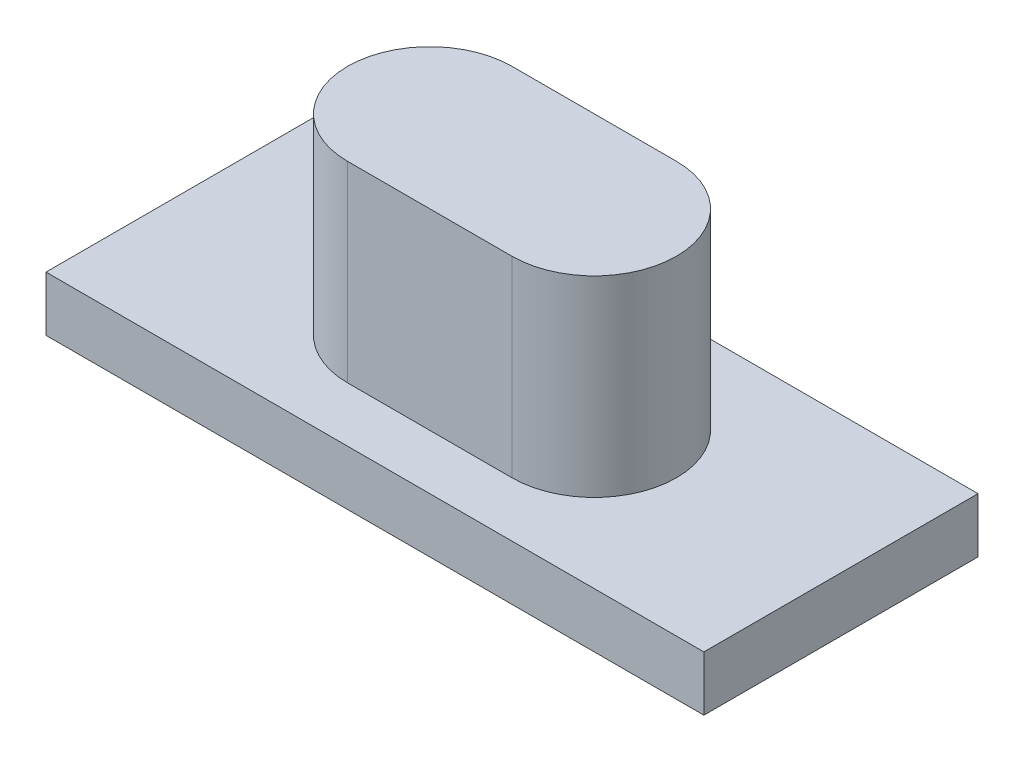
ISO-10303-21;
HEADER;
FILE_DESCRIPTION(('STEP AP214'),'2;1');
FILE_NAME('part.step','',(''),(''),'','','');
FILE_SCHEMA(('AUTOMOTIVE_DESIGN { 1 0 10303 214 1 1 1 1 }'));
ENDSEC;
DATA;
#1=APPLICATION_CONTEXT('core data for automotive mechanical design processes');
#2=APPLICATION_PROTOCOL_DEFINITION('international standard','automotive_design',2000,#1);
#3=PRODUCT_CONTEXT('',#1,'mechanical');
#4=PRODUCT('Part','Part','',(#3));
#5=PRODUCT_RELATED_PRODUCT_CATEGORY('part','',(#4));
#6=PRODUCT_DEFINITION_FORMATION('','',#4);
#7=PRODUCT_DEFINITION_CONTEXT('part definition',#1,'design');
#8=PRODUCT_DEFINITION('design','',#6,#7);
#9=PRODUCT_DEFINITION_SHAPE('','',#8);
#10=(LENGTH_UNIT() NAMED_UNIT(*) SI_UNIT(.MILLI.,.METRE.));
#11=(NAMED_UNIT(*) PLANE_ANGLE_UNIT() SI_UNIT($,.RADIAN.));
#12=(NAMED_UNIT(*) SI_UNIT($,.STERADIAN.) SOLID_ANGLE_UNIT());
#13=UNCERTAINTY_MEASURE_WITH_UNIT(LENGTH_MEASURE(1.E-05),#10,'distance_accuracy_value','');
#14=(GEOMETRIC_REPRESENTATION_CONTEXT(3) GLOBAL_UNCERTAINTY_ASSIGNED_CONTEXT((#13)) GLOBAL_UNIT_ASSIGNED_CONTEXT((#10,
#11,#12)) REPRESENTATION_CONTEXT('',''));
#15=CARTESIAN_POINT('',(0.,0.,0.));
#16=DIRECTION('',(0.,0.,1.));
#17=DIRECTION('',(1.,0.,0.));
#18=AXIS2_PLACEMENT_3D('',#15,#16,#17);
#19=CARTESIAN_POINT('',(54.8701352513138,3.5,21.6679368079828));
#20=DIRECTION('',(0.,-1.,0.));
#21=DIRECTION('',(0.,0.,-1.));
#22=AXIS2_PLACEMENT_3D('',#19,#20,#21);
#23=CYLINDRICAL_SURFACE('',#22,1.5);
#24=CARTESIAN_POINT('',(54.8701352513138,0.,21.6679368079828));
#25=DIRECTION('',(0.,1.,0.));
#26=DIRECTION('',(0.,0.,1.));
#27=AXIS2_PLACEMENT_3D('',#24,#25,#26);
#28=CIRCLE('',#27,1.5);
#29=CARTESIAN_POINT('',(54.8701352513138,0.,20.1679368079828));
#30=VERTEX_POINT('',#29);
#31=CARTESIAN_POINT('',(54.8701352513138,0.,23.1679368079828));
#32=VERTEX_POINT('',#31);
#33=EDGE_CURVE('E88',#30,#32,#28,.T.);
#34=ORIENTED_EDGE('',*,*,#33,.T.);
#35=DIRECTION('',(0.,-1.,0.));
#36=VECTOR('',#35,1.);
#37=CARTESIAN_POINT('',(54.8701352513138,3.5,23.1679368079828));
#38=LINE('',#37,#36);
#39=CARTESIAN_POINT('',(54.8701352513138,3.5,23.1679368079828));
#40=VERTEX_POINT('',#39);
#41=EDGE_CURVE('E11',#40,#32,#38,.T.);
#42=ORIENTED_EDGE('',*,*,#41,.F.);
#43=CARTESIAN_POINT('',(54.8701352513138,3.5,21.6679368079828));
#44=DIRECTION('',(0.,1.,0.));
#45=DIRECTION('',(0.,0.,1.));
#46=AXIS2_PLACEMENT_3D('',#43,#44,#45);
#47=CIRCLE('',#46,1.5);
#48=CARTESIAN_POINT('',(54.8701352513138,3.5,20.1679368079828));
#49=VERTEX_POINT('',#48);
#50=EDGE_CURVE('E102',#49,#40,#47,.T.);
#51=ORIENTED_EDGE('',*,*,#50,.F.);
#52=DIRECTION('',(0.,-1.,0.));
#53=VECTOR('',#52,1.);
#54=CARTESIAN_POINT('',(54.8701352513138,3.5,20.1679368079828));
#55=LINE('',#54,#53);
#56=EDGE_CURVE('E66',#49,#30,#55,.T.);
#57=ORIENTED_EDGE('',*,*,#56,.T.);
#58=EDGE_LOOP('',(#34,#42,#51,#57));
#59=FACE_BOUND('',#58,.T.);
#60=ADVANCED_FACE('F43',(#59),#23,.T.);
#61=CARTESIAN_POINT('',(54.8701352513138,3.5,23.1679368079828));
#62=DIRECTION('',(0.,0.,-1.));
#63=DIRECTION('',(-1.,0.,0.));
#64=AXIS2_PLACEMENT_3D('',#61,#62,#63);
#65=PLANE('',#64);
#66=DIRECTION('',(1.,0.,0.));
#67=VECTOR('',#66,1.);
#68=CARTESIAN_POINT('',(54.8701352513138,0.,23.1679368079828));
#69=LINE('',#68,#67);
#70=CARTESIAN_POINT('',(57.8701352513138,0.,23.1679368079828));
#71=VERTEX_POINT('',#70);
#72=EDGE_CURVE('E108',#32,#71,#69,.T.);
#73=ORIENTED_EDGE('',*,*,#72,.T.);
#74=DIRECTION('',(0.,-1.,0.));
#75=VECTOR('',#74,1.);
#76=CARTESIAN_POINT('',(57.8701352513138,3.5,23.1679368079828));
#77=LINE('',#76,#75);
#78=CARTESIAN_POINT('',(57.8701352513138,3.5,23.1679368079828));
#79=VERTEX_POINT('',#78);
#80=EDGE_CURVE('E50',#79,#71,#77,.T.);
#81=ORIENTED_EDGE('',*,*,#80,.F.);
#82=DIRECTION('',(1.,0.,0.));
#83=VECTOR('',#82,1.);
#84=CARTESIAN_POINT('',(54.8701352513138,3.5,23.1679368079828));
#85=LINE('',#84,#83);
#86=EDGE_CURVE('E95',#40,#79,#85,.T.);
#87=ORIENTED_EDGE('',*,*,#86,.F.);
#88=ORIENTED_EDGE('',*,*,#41,.T.);
#89=EDGE_LOOP('',(#73,#81,#87,#88));
#90=FACE_BOUND('',#89,.T.);
#91=ADVANCED_FACE('F107',(#90),#65,.F.);
#92=CARTESIAN_POINT('',(57.8701352513138,3.5,21.6679368079828));
#93=DIRECTION('',(0.,-1.,0.));
#94=DIRECTION('',(0.,0.,-1.));
#95=AXIS2_PLACEMENT_3D('',#92,#93,#94);
#96=CYLINDRICAL_SURFACE('',#95,1.5);
#97=CARTESIAN_POINT('',(57.8701352513138,0.,21.6679368079828));
#98=DIRECTION('',(0.,1.,0.));
#99=DIRECTION('',(0.,0.,1.));
#100=AXIS2_PLACEMENT_3D('',#97,#98,#99);
#101=CIRCLE('',#100,1.5);
#102=CARTESIAN_POINT('',(57.8701352513138,0.,20.1679368079828));
#103=VERTEX_POINT('',#102);
#104=EDGE_CURVE('E80',#71,#103,#101,.T.);
#105=ORIENTED_EDGE('',*,*,#104,.T.);
#106=DIRECTION('',(0.,-1.,0.));
#107=VECTOR('',#106,1.);
#108=CARTESIAN_POINT('',(57.8701352513138,3.5,20.1679368079828));
#109=LINE('',#108,#107);
#110=CARTESIAN_POINT('',(57.8701352513138,3.5,20.1679368079828));
#111=VERTEX_POINT('',#110);
#112=EDGE_CURVE('E110',#111,#103,#109,.T.);
#113=ORIENTED_EDGE('',*,*,#112,.F.);
#114=CARTESIAN_POINT('',(57.8701352513138,3.5,21.6679368079828));
#115=DIRECTION('',(0.,1.,0.));
#116=DIRECTION('',(0.,0.,1.));
#117=AXIS2_PLACEMENT_3D('',#114,#115,#116);
#118=CIRCLE('',#117,1.5);
#119=EDGE_CURVE('E100',#79,#111,#118,.T.);
#120=ORIENTED_EDGE('',*,*,#119,.F.);
#121=ORIENTED_EDGE('',*,*,#80,.T.);
#122=EDGE_LOOP('',(#105,#113,#120,#121));
#123=FACE_BOUND('',#122,.T.);
#124=ADVANCED_FACE('F111',(#123),#96,.T.);
#125=CARTESIAN_POINT('',(54.8701352513138,3.5,20.1679368079828));
#126=DIRECTION('',(0.,0.,-1.));
#127=DIRECTION('',(-1.,0.,0.));
#128=AXIS2_PLACEMENT_3D('',#125,#126,#127);
#129=PLANE('',#128);
#130=DIRECTION('',(1.,0.,0.));
#131=VECTOR('',#130,1.);
#132=CARTESIAN_POINT('',(54.8701352513138,0.,20.1679368079828));
#133=LINE('',#132,#131);
#134=EDGE_CURVE('E122',#30,#103,#133,.T.);
#135=ORIENTED_EDGE('',*,*,#134,.F.);
#136=ORIENTED_EDGE('',*,*,#56,.F.);
#137=DIRECTION('',(1.,0.,0.));
#138=VECTOR('',#137,1.);
#139=CARTESIAN_POINT('',(54.8701352513138,3.5,20.1679368079828));
#140=LINE('',#139,#138);
#141=EDGE_CURVE('E113',#49,#111,#140,.T.);
#142=ORIENTED_EDGE('',*,*,#141,.T.);
#143=ORIENTED_EDGE('',*,*,#112,.T.);
#144=EDGE_LOOP('',(#135,#136,#142,#143));
#145=FACE_BOUND('',#144,.T.);
#146=ADVANCED_FACE('F125',(#145),#129,.T.);
#147=CARTESIAN_POINT('',(54.8701352513138,3.5,21.6679368079828));
#148=DIRECTION('',(0.,1.,0.));
#149=DIRECTION('',(0.,0.,1.));
#150=AXIS2_PLACEMENT_3D('',#147,#148,#149);
#151=PLANE('',#150);
#152=ORIENTED_EDGE('',*,*,#50,.T.);
#153=ORIENTED_EDGE('',*,*,#86,.T.);
#154=ORIENTED_EDGE('',*,*,#119,.T.);
#155=ORIENTED_EDGE('',*,*,#141,.F.);
#156=EDGE_LOOP('',(#152,#153,#154,#155));
#157=FACE_BOUND('',#156,.T.);
#158=ADVANCED_FACE('F97',(#157),#151,.T.);
#159=CARTESIAN_POINT('',(50.3701352513138,-1.,24.1679368079828));
#160=DIRECTION('',(1.,0.,0.));
#161=DIRECTION('',(0.,0.,-1.));
#162=AXIS2_PLACEMENT_3D('',#159,#160,#161);
#163=PLANE('',#162);
#164=DIRECTION('',(0.,0.,-1.));
#165=VECTOR('',#164,1.);
#166=CARTESIAN_POINT('',(50.3701352513138,0.,24.1679368079828));
#167=LINE('',#166,#165);
#168=CARTESIAN_POINT('',(50.3701352513138,0.,24.1679368079828));
#169=VERTEX_POINT('',#168);
#170=CARTESIAN_POINT('',(50.3701352513138,0.,19.1679368079828));
#171=VERTEX_POINT('',#170);
#172=EDGE_CURVE('E137',#169,#171,#167,.T.);
#173=ORIENTED_EDGE('',*,*,#172,.T.);
#174=DIRECTION('',(0.,1.,0.));
#175=VECTOR('',#174,1.);
#176=CARTESIAN_POINT('',(50.3701352513138,-1.,19.1679368079828));
#177=LINE('',#176,#175);
#178=CARTESIAN_POINT('',(50.3701352513138,-1.,19.1679368079828));
#179=VERTEX_POINT('',#178);
#180=EDGE_CURVE('E119',#179,#171,#177,.T.);
#181=ORIENTED_EDGE('',*,*,#180,.F.);
#182=DIRECTION('',(0.,0.,-1.));
#183=VECTOR('',#182,1.);
#184=CARTESIAN_POINT('',(50.3701352513138,-1.,24.1679368079828));
#185=LINE('',#184,#183);
#186=CARTESIAN_POINT('',(50.3701352513138,-1.,24.1679368079828));
#187=VERTEX_POINT('',#186);
#188=EDGE_CURVE('E164',#187,#179,#185,.T.);
#189=ORIENTED_EDGE('',*,*,#188,.F.);
#190=DIRECTION('',(0.,1.,0.));
#191=VECTOR('',#190,1.);
#192=CARTESIAN_POINT('',(50.3701352513138,-1.,24.1679368079828));
#193=LINE('',#192,#191);
#194=EDGE_CURVE('E165',#187,#169,#193,.T.);
#195=ORIENTED_EDGE('',*,*,#194,.T.);
#196=EDGE_LOOP('',(#173,#181,#189,#195));
#197=FACE_BOUND('',#196,.T.);
#198=ADVANCED_FACE('F184',(#197),#163,.F.);
#199=CARTESIAN_POINT('',(50.3701352513138,-1.,19.1679368079828));
#200=DIRECTION('',(0.,0.,1.));
#201=DIRECTION('',(1.,0.,0.));
#202=AXIS2_PLACEMENT_3D('',#199,#200,#201);
#203=PLANE('',#202);
#204=DIRECTION('',(1.,0.,0.));
#205=VECTOR('',#204,1.);
#206=CARTESIAN_POINT('',(50.3701352513138,0.,19.1679368079828));
#207=LINE('',#206,#205);
#208=CARTESIAN_POINT('',(62.3701352513138,0.,19.1679368079828));
#209=VERTEX_POINT('',#208);
#210=EDGE_CURVE('E144',#171,#209,#207,.T.);
#211=ORIENTED_EDGE('',*,*,#210,.T.);
#212=DIRECTION('',(0.,1.,0.));
#213=VECTOR('',#212,1.);
#214=CARTESIAN_POINT('',(62.3701352513138,-1.,19.1679368079828));
#215=LINE('',#214,#213);
#216=CARTESIAN_POINT('',(62.3701352513138,-1.,19.1679368079828));
#217=VERTEX_POINT('',#216);
#218=EDGE_CURVE('E170',#217,#209,#215,.T.);
#219=ORIENTED_EDGE('',*,*,#218,.F.);
#220=DIRECTION('',(1.,0.,0.));
#221=VECTOR('',#220,1.);
#222=CARTESIAN_POINT('',(50.3701352513138,-1.,19.1679368079828));
#223=LINE('',#222,#221);
#224=EDGE_CURVE('E179',#179,#217,#223,.T.);
#225=ORIENTED_EDGE('',*,*,#224,.F.);
#226=ORIENTED_EDGE('',*,*,#180,.T.);
#227=EDGE_LOOP('',(#211,#219,#225,#226));
#228=FACE_BOUND('',#227,.T.);
#229=ADVANCED_FACE('F175',(#228),#203,.F.);
#230=CARTESIAN_POINT('',(62.3701352513138,-1.,19.1679368079828));
#231=DIRECTION('',(-1.,0.,0.));
#232=DIRECTION('',(0.,0.,1.));
#233=AXIS2_PLACEMENT_3D('',#230,#231,#232);
#234=PLANE('',#233);
#235=DIRECTION('',(0.,0.,1.));
#236=VECTOR('',#235,1.);
#237=CARTESIAN_POINT('',(62.3701352513138,0.,19.1679368079828));
#238=LINE('',#237,#236);
#239=CARTESIAN_POINT('',(62.3701352513138,0.,24.1679368079828));
#240=VERTEX_POINT('',#239);
#241=EDGE_CURVE('E153',#209,#240,#238,.T.);
#242=ORIENTED_EDGE('',*,*,#241,.T.);
#243=DIRECTION('',(0.,1.,0.));
#244=VECTOR('',#243,1.);
#245=CARTESIAN_POINT('',(62.3701352513138,-1.,24.1679368079828));
#246=LINE('',#245,#244);
#247=CARTESIAN_POINT('',(62.3701352513138,-1.,24.1679368079828));
#248=VERTEX_POINT('',#247);
#249=EDGE_CURVE('E167',#248,#240,#246,.T.);
#250=ORIENTED_EDGE('',*,*,#249,.F.);
#251=DIRECTION('',(0.,0.,1.));
#252=VECTOR('',#251,1.);
#253=CARTESIAN_POINT('',(62.3701352513138,-1.,19.1679368079828));
#254=LINE('',#253,#252);
#255=EDGE_CURVE('E287',#217,#248,#254,.T.);
#256=ORIENTED_EDGE('',*,*,#255,.F.);
#257=ORIENTED_EDGE('',*,*,#218,.T.);
#258=EDGE_LOOP('',(#242,#250,#256,#257));
#259=FACE_BOUND('',#258,.T.);
#260=ADVANCED_FACE('F219',(#259),#234,.F.);
#261=CARTESIAN_POINT('',(62.3701352513138,-1.,24.1679368079828));
#262=DIRECTION('',(0.,0.,-1.));
#263=DIRECTION('',(-1.,0.,0.));
#264=AXIS2_PLACEMENT_3D('',#261,#262,#263);
#265=PLANE('',#264);
#266=DIRECTION('',(-1.,0.,0.));
#267=VECTOR('',#266,1.);
#268=CARTESIAN_POINT('',(62.3701352513138,0.,24.1679368079828));
#269=LINE('',#268,#267);
#270=EDGE_CURVE('E141',#240,#169,#269,.T.);
#271=ORIENTED_EDGE('',*,*,#270,.T.);
#272=ORIENTED_EDGE('',*,*,#194,.F.);
#273=DIRECTION('',(-1.,0.,0.));
#274=VECTOR('',#273,1.);
#275=CARTESIAN_POINT('',(62.3701352513138,-1.,24.1679368079828));
#276=LINE('',#275,#274);
#277=EDGE_CURVE('E158',#248,#187,#276,.T.);
#278=ORIENTED_EDGE('',*,*,#277,.F.);
#279=ORIENTED_EDGE('',*,*,#249,.T.);
#280=EDGE_LOOP('',(#271,#272,#278,#279));
#281=FACE_BOUND('',#280,.T.);
#282=ADVANCED_FACE('F222',(#281),#265,.F.);
#283=CARTESIAN_POINT('',(0.,-1.,0.));
#284=DIRECTION('',(0.,-1.,0.));
#285=DIRECTION('',(0.,0.,-1.));
#286=AXIS2_PLACEMENT_3D('',#283,#284,#285);
#287=PLANE('',#286);
#288=DIRECTION('',(0.,0.,-1.));
#289=VECTOR('',#288,1.);
#290=CARTESIAN_POINT('',(55.2701352513138,-1.,20.5679368079828));
#291=LINE('',#290,#289);
#292=CARTESIAN_POINT('',(55.2701352513138,-1.,22.7679368079828));
#293=VERTEX_POINT('',#292);
#294=CARTESIAN_POINT('',(55.2701352513138,-1.,20.5679368079828));
#295=VERTEX_POINT('',#294);
#296=EDGE_CURVE('E57',#293,#295,#291,.T.);
#297=ORIENTED_EDGE('',*,*,#296,.F.);
#298=DIRECTION('',(-1.,0.,0.));
#299=VECTOR('',#298,1.);
#300=CARTESIAN_POINT('',(57.4701352513138,-1.,22.7679368079828));
#301=LINE('',#300,#299);
#302=CARTESIAN_POINT('',(57.4701352513138,-1.,22.7679368079828));
#303=VERTEX_POINT('',#302);
#304=EDGE_CURVE('E263',#303,#293,#301,.T.);
#305=ORIENTED_EDGE('',*,*,#304,.F.);
#306=DIRECTION('',(0.,0.,1.));
#307=VECTOR('',#306,1.);
#308=CARTESIAN_POINT('',(57.4701352513138,-1.,20.5679368079828));
#309=LINE('',#308,#307);
#310=CARTESIAN_POINT('',(57.4701352513138,-1.,20.5679368079828));
#311=VERTEX_POINT('',#310);
#312=EDGE_CURVE('E268',#311,#303,#309,.T.);
#313=ORIENTED_EDGE('',*,*,#312,.F.);
#314=DIRECTION('',(1.,0.,0.));
#315=VECTOR('',#314,1.);
#316=CARTESIAN_POINT('',(57.4701352513138,-1.,20.5679368079828));
#317=LINE('',#316,#315);
#318=EDGE_CURVE('E275',#295,#311,#317,.T.);
#319=ORIENTED_EDGE('',*,*,#318,.F.);
#320=EDGE_LOOP('',(#297,#305,#313,#319));
#321=FACE_BOUND('',#320,.T.);
#322=ORIENTED_EDGE('',*,*,#188,.T.);
#323=ORIENTED_EDGE('',*,*,#224,.T.);
#324=ORIENTED_EDGE('',*,*,#255,.T.);
#325=ORIENTED_EDGE('',*,*,#277,.T.);
#326=EDGE_LOOP('',(#322,#323,#324,#325));
#327=FACE_BOUND('',#326,.T.);
#328=ADVANCED_FACE('F130',(#321,#327),#287,.T.);
#329=CARTESIAN_POINT('',(0.,0.,0.));
#330=DIRECTION('',(0.,-1.,0.));
#331=DIRECTION('',(0.,0.,-1.));
#332=AXIS2_PLACEMENT_3D('',#329,#330,#331);
#333=PLANE('',#332);
#334=ORIENTED_EDGE('',*,*,#33,.F.);
#335=ORIENTED_EDGE('',*,*,#134,.T.);
#336=ORIENTED_EDGE('',*,*,#104,.F.);
#337=ORIENTED_EDGE('',*,*,#72,.F.);
#338=EDGE_LOOP('',(#334,#335,#336,#337));
#339=FACE_BOUND('',#338,.T.);
#340=ORIENTED_EDGE('',*,*,#172,.F.);
#341=ORIENTED_EDGE('',*,*,#270,.F.);
#342=ORIENTED_EDGE('',*,*,#241,.F.);
#343=ORIENTED_EDGE('',*,*,#210,.F.);
#344=EDGE_LOOP('',(#340,#341,#342,#343));
#345=FACE_BOUND('',#344,.T.);
#346=ADVANCED_FACE('F126',(#339,#345),#333,.F.);
#347=CARTESIAN_POINT('',(55.2701352513138,2.5,20.5679368079828));
#348=DIRECTION('',(-1.,0.,0.));
#349=DIRECTION('',(0.,0.,1.));
#350=AXIS2_PLACEMENT_3D('',#347,#348,#349);
#351=PLANE('',#350);
#352=ORIENTED_EDGE('',*,*,#296,.T.);
#353=DIRECTION('',(0.,-1.,0.));
#354=VECTOR('',#353,1.);
#355=CARTESIAN_POINT('',(55.2701352513138,2.5,20.5679368079828));
#356=LINE('',#355,#354);
#357=CARTESIAN_POINT('',(55.2701352513138,2.5,20.5679368079828));
#358=VERTEX_POINT('',#357);
#359=EDGE_CURVE('E273',#358,#295,#356,.T.);
#360=ORIENTED_EDGE('',*,*,#359,.F.);
#361=DIRECTION('',(0.,0.,-1.));
#362=VECTOR('',#361,1.);
#363=CARTESIAN_POINT('',(55.2701352513138,2.5,20.5679368079828));
#364=LINE('',#363,#362);
#365=CARTESIAN_POINT('',(55.2701352513138,2.5,22.7679368079828));
#366=VERTEX_POINT('',#365);
#367=EDGE_CURVE('E255',#366,#358,#364,.T.);
#368=ORIENTED_EDGE('',*,*,#367,.F.);
#369=DIRECTION('',(0.,-1.,0.));
#370=VECTOR('',#369,1.);
#371=CARTESIAN_POINT('',(55.2701352513138,2.5,22.7679368079828));
#372=LINE('',#371,#370);
#373=EDGE_CURVE('E151',#366,#293,#372,.T.);
#374=ORIENTED_EDGE('',*,*,#373,.T.);
#375=EDGE_LOOP('',(#352,#360,#368,#374));
#376=FACE_BOUND('',#375,.T.);
#377=ADVANCED_FACE('F129',(#376),#351,.F.);
#378=CARTESIAN_POINT('',(57.4701352513138,2.5,22.7679368079828));
#379=DIRECTION('',(0.,0.,1.));
#380=DIRECTION('',(1.,0.,0.));
#381=AXIS2_PLACEMENT_3D('',#378,#379,#380);
#382=PLANE('',#381);
#383=ORIENTED_EDGE('',*,*,#304,.T.);
#384=ORIENTED_EDGE('',*,*,#373,.F.);
#385=DIRECTION('',(-1.,0.,0.));
#386=VECTOR('',#385,1.);
#387=CARTESIAN_POINT('',(57.4701352513138,2.5,22.7679368079828));
#388=LINE('',#387,#386);
#389=CARTESIAN_POINT('',(57.4701352513138,2.5,22.7679368079828));
#390=VERTEX_POINT('',#389);
#391=EDGE_CURVE('E261',#390,#366,#388,.T.);
#392=ORIENTED_EDGE('',*,*,#391,.F.);
#393=DIRECTION('',(0.,-1.,0.));
#394=VECTOR('',#393,1.);
#395=CARTESIAN_POINT('',(57.4701352513138,2.5,22.7679368079828));
#396=LINE('',#395,#394);
#397=EDGE_CURVE('E155',#390,#303,#396,.T.);
#398=ORIENTED_EDGE('',*,*,#397,.T.);
#399=EDGE_LOOP('',(#383,#384,#392,#398));
#400=FACE_BOUND('',#399,.T.);
#401=ADVANCED_FACE('F232',(#400),#382,.F.);
#402=CARTESIAN_POINT('',(57.4701352513138,2.5,20.5679368079828));
#403=DIRECTION('',(1.,0.,0.));
#404=DIRECTION('',(0.,0.,-1.));
#405=AXIS2_PLACEMENT_3D('',#402,#403,#404);
#406=PLANE('',#405);
#407=ORIENTED_EDGE('',*,*,#312,.T.);
#408=ORIENTED_EDGE('',*,*,#397,.F.);
#409=DIRECTION('',(0.,0.,1.));
#410=VECTOR('',#409,1.);
#411=CARTESIAN_POINT('',(57.4701352513138,2.5,20.5679368079828));
#412=LINE('',#411,#410);
#413=CARTESIAN_POINT('',(57.4701352513138,2.5,20.5679368079828));
#414=VERTEX_POINT('',#413);
#415=EDGE_CURVE('E265',#414,#390,#412,.T.);
#416=ORIENTED_EDGE('',*,*,#415,.F.);
#417=DIRECTION('',(0.,-1.,0.));
#418=VECTOR('',#417,1.);
#419=CARTESIAN_POINT('',(57.4701352513138,2.5,20.5679368079828));
#420=LINE('',#419,#418);
#421=EDGE_CURVE('E282',#414,#311,#420,.T.);
#422=ORIENTED_EDGE('',*,*,#421,.T.);
#423=EDGE_LOOP('',(#407,#408,#416,#422));
#424=FACE_BOUND('',#423,.T.);
#425=ADVANCED_FACE('F237',(#424),#406,.F.);
#426=CARTESIAN_POINT('',(57.4701352513138,2.5,20.5679368079828));
#427=DIRECTION('',(0.,0.,-1.));
#428=DIRECTION('',(-1.,0.,0.));
#429=AXIS2_PLACEMENT_3D('',#426,#427,#428);
#430=PLANE('',#429);
#431=ORIENTED_EDGE('',*,*,#318,.T.);
#432=ORIENTED_EDGE('',*,*,#421,.F.);
#433=DIRECTION('',(1.,0.,0.));
#434=VECTOR('',#433,1.);
#435=CARTESIAN_POINT('',(57.4701352513138,2.5,20.5679368079828));
#436=LINE('',#435,#434);
#437=EDGE_CURVE('E259',#358,#414,#436,.T.);
#438=ORIENTED_EDGE('',*,*,#437,.F.);
#439=ORIENTED_EDGE('',*,*,#359,.T.);
#440=EDGE_LOOP('',(#431,#432,#438,#439));
#441=FACE_BOUND('',#440,.T.);
#442=ADVANCED_FACE('F233',(#441),#430,.F.);
#443=CARTESIAN_POINT('',(0.,2.5,0.));
#444=DIRECTION('',(0.,-1.,0.));
#445=DIRECTION('',(0.,0.,-1.));
#446=AXIS2_PLACEMENT_3D('',#443,#444,#445);
#447=PLANE('',#446);
#448=ORIENTED_EDGE('',*,*,#367,.T.);
#449=ORIENTED_EDGE('',*,*,#437,.T.);
#450=ORIENTED_EDGE('',*,*,#415,.T.);
#451=ORIENTED_EDGE('',*,*,#391,.T.);
#452=EDGE_LOOP('',(#448,#449,#450,#451));
#453=FACE_BOUND('',#452,.T.);
#454=ADVANCED_FACE('F236',(#453),#447,.T.);
#455=CLOSED_SHELL('',(#60,#91,#124,#146,#158,#198,#229,#260,#282,#328,#346,#377,#401,#425,#442,#454));
#456=MANIFOLD_SOLID_BREP('B2',#455);
#457=ADVANCED_BREP_SHAPE_REPRESENTATION('',(#18,#456),#14);
#458=SHAPE_DEFINITION_REPRESENTATION(#9,#457);
ENDSEC;
END-ISO-10303-21;
